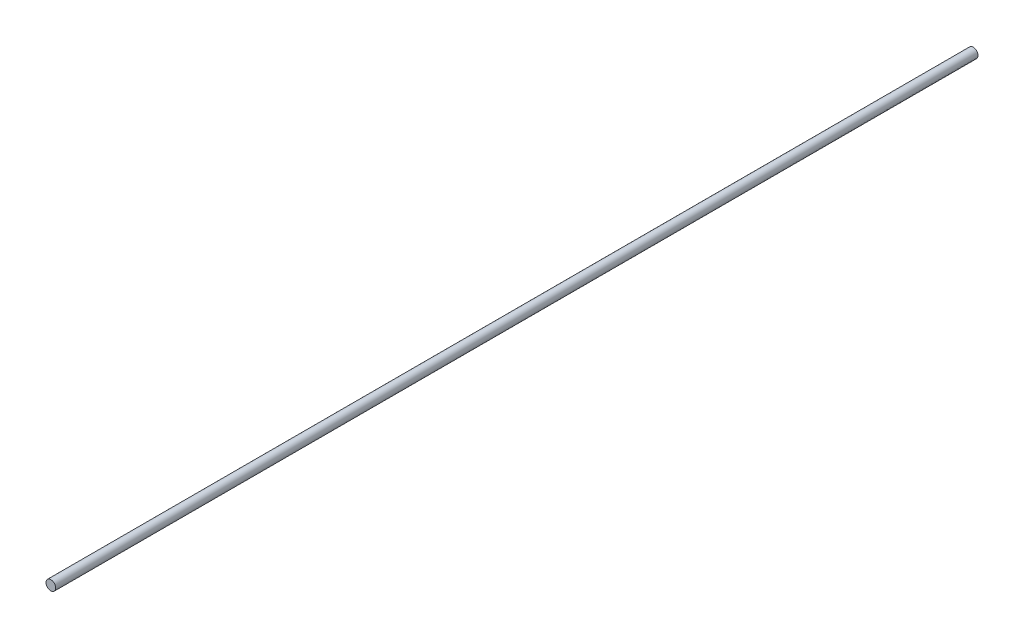
ISO-10303-21;
HEADER;
FILE_DESCRIPTION(('STEP AP214'),'2;1');
FILE_NAME('part.step','',(''),(''),'','','');
FILE_SCHEMA(('AUTOMOTIVE_DESIGN { 1 0 10303 214 1 1 1 1 }'));
ENDSEC;
DATA;
#1=APPLICATION_CONTEXT('core data for automotive mechanical design processes');
#2=APPLICATION_PROTOCOL_DEFINITION('international standard','automotive_design',2000,#1);
#3=PRODUCT_CONTEXT('',#1,'mechanical');
#4=PRODUCT('Part','Part','',(#3));
#5=PRODUCT_RELATED_PRODUCT_CATEGORY('part','',(#4));
#6=PRODUCT_DEFINITION_FORMATION('','',#4);
#7=PRODUCT_DEFINITION_CONTEXT('part definition',#1,'design');
#8=PRODUCT_DEFINITION('design','',#6,#7);
#9=PRODUCT_DEFINITION_SHAPE('','',#8);
#10=(LENGTH_UNIT() NAMED_UNIT(*) SI_UNIT(.MILLI.,.METRE.));
#11=(NAMED_UNIT(*) PLANE_ANGLE_UNIT() SI_UNIT($,.RADIAN.));
#12=(NAMED_UNIT(*) SI_UNIT($,.STERADIAN.) SOLID_ANGLE_UNIT());
#13=UNCERTAINTY_MEASURE_WITH_UNIT(LENGTH_MEASURE(1.E-05),#10,'distance_accuracy_value','');
#14=(GEOMETRIC_REPRESENTATION_CONTEXT(3) GLOBAL_UNCERTAINTY_ASSIGNED_CONTEXT((#13)) GLOBAL_UNIT_ASSIGNED_CONTEXT((#10,
#11,#12)) REPRESENTATION_CONTEXT('',''));
#15=CARTESIAN_POINT('',(0.,0.,0.));
#16=DIRECTION('',(0.,0.,1.));
#17=DIRECTION('',(1.,0.,0.));
#18=AXIS2_PLACEMENT_3D('',#15,#16,#17);
#19=CARTESIAN_POINT('',(0.,0.,190.));
#20=DIRECTION('',(0.,0.,-1.));
#21=DIRECTION('',(-1.,0.,0.));
#22=AXIS2_PLACEMENT_3D('',#19,#20,#21);
#23=CYLINDRICAL_SURFACE('',#22,1.);
#24=CARTESIAN_POINT('',(0.,0.,190.));
#25=DIRECTION('',(0.,0.,1.));
#26=DIRECTION('',(1.,0.,0.));
#27=AXIS2_PLACEMENT_3D('',#24,#25,#26);
#28=CIRCLE('',#27,1.);
#29=CARTESIAN_POINT('',(1.,0.,190.));
#30=VERTEX_POINT('',#29);
#31=EDGE_CURVE('E10',#30,#30,#28,.T.);
#32=ORIENTED_EDGE('',*,*,#31,.F.);
#33=EDGE_LOOP('',(#32));
#34=FACE_BOUND('',#33,.T.);
#35=CARTESIAN_POINT('',(0.,0.,0.));
#36=DIRECTION('',(0.,0.,1.));
#37=DIRECTION('',(1.,0.,0.));
#38=AXIS2_PLACEMENT_3D('',#35,#36,#37);
#39=CIRCLE('',#38,1.);
#40=CARTESIAN_POINT('',(1.,0.,0.));
#41=VERTEX_POINT('',#40);
#42=EDGE_CURVE('E38',#41,#41,#39,.T.);
#43=ORIENTED_EDGE('',*,*,#42,.T.);
#44=EDGE_LOOP('',(#43));
#45=FACE_BOUND('',#44,.T.);
#46=ADVANCED_FACE('F35',(#34,#45),#23,.T.);
#47=CARTESIAN_POINT('',(0.,0.,190.));
#48=DIRECTION('',(0.,0.,1.));
#49=DIRECTION('',(1.,0.,0.));
#50=AXIS2_PLACEMENT_3D('',#47,#48,#49);
#51=PLANE('',#50);
#52=ORIENTED_EDGE('',*,*,#31,.T.);
#53=EDGE_LOOP('',(#52));
#54=FACE_BOUND('',#53,.T.);
#55=ADVANCED_FACE('F50',(#54),#51,.T.);
#56=CARTESIAN_POINT('',(0.,0.,0.));
#57=DIRECTION('',(0.,0.,1.));
#58=DIRECTION('',(1.,0.,0.));
#59=AXIS2_PLACEMENT_3D('',#56,#57,#58);
#60=PLANE('',#59);
#61=ORIENTED_EDGE('',*,*,#42,.F.);
#62=EDGE_LOOP('',(#61));
#63=FACE_BOUND('',#62,.T.);
#64=ADVANCED_FACE('F48',(#63),#60,.F.);
#65=CLOSED_SHELL('',(#46,#55,#64));
#66=MANIFOLD_SOLID_BREP('B2',#65);
#67=ADVANCED_BREP_SHAPE_REPRESENTATION('',(#18,#66),#14);
#68=SHAPE_DEFINITION_REPRESENTATION(#9,#67);
ENDSEC;
END-ISO-10303-21;
